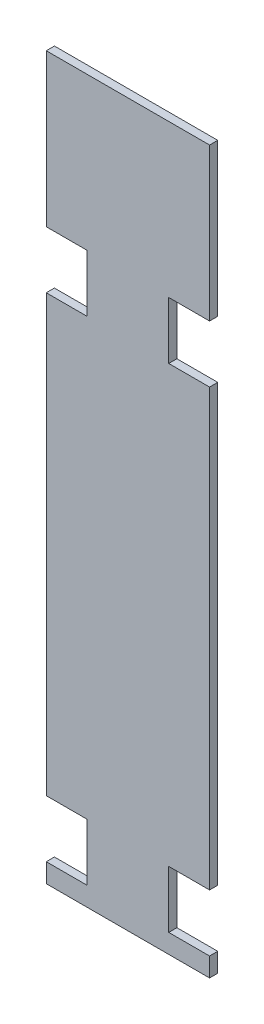
ISO-10303-21;
HEADER;
FILE_DESCRIPTION(('STEP AP214'),'2;1');
FILE_NAME('part.step','',(''),(''),'','','');
FILE_SCHEMA(('AUTOMOTIVE_DESIGN { 1 0 10303 214 1 1 1 1 }'));
ENDSEC;
DATA;
#1=APPLICATION_CONTEXT('core data for automotive mechanical design processes');
#2=APPLICATION_PROTOCOL_DEFINITION('international standard','automotive_design',2000,#1);
#3=PRODUCT_CONTEXT('',#1,'mechanical');
#4=PRODUCT('Part','Part','',(#3));
#5=PRODUCT_RELATED_PRODUCT_CATEGORY('part','',(#4));
#6=PRODUCT_DEFINITION_FORMATION('','',#4);
#7=PRODUCT_DEFINITION_CONTEXT('part definition',#1,'design');
#8=PRODUCT_DEFINITION('design','',#6,#7);
#9=PRODUCT_DEFINITION_SHAPE('','',#8);
#10=(LENGTH_UNIT() NAMED_UNIT(*) SI_UNIT(.MILLI.,.METRE.));
#11=(NAMED_UNIT(*) PLANE_ANGLE_UNIT() SI_UNIT($,.RADIAN.));
#12=(NAMED_UNIT(*) SI_UNIT($,.STERADIAN.) SOLID_ANGLE_UNIT());
#13=UNCERTAINTY_MEASURE_WITH_UNIT(LENGTH_MEASURE(1.E-05),#10,'distance_accuracy_value','');
#14=(GEOMETRIC_REPRESENTATION_CONTEXT(3) GLOBAL_UNCERTAINTY_ASSIGNED_CONTEXT((#13)) GLOBAL_UNIT_ASSIGNED_CONTEXT((#10,
#11,#12)) REPRESENTATION_CONTEXT('',''));
#15=CARTESIAN_POINT('',(0.,0.,0.));
#16=DIRECTION('',(0.,0.,1.));
#17=DIRECTION('',(1.,0.,0.));
#18=AXIS2_PLACEMENT_3D('',#15,#16,#17);
#19=CARTESIAN_POINT('',(60.,265.,3.));
#20=DIRECTION('',(-1.,0.,0.));
#21=DIRECTION('',(0.,0.,1.));
#22=AXIS2_PLACEMENT_3D('',#19,#20,#21);
#23=PLANE('',#22);
#24=DIRECTION('',(0.,1.,0.));
#25=VECTOR('',#24,1.);
#26=CARTESIAN_POINT('',(60.,0.,3.));
#27=LINE('',#26,#25);
#28=CARTESIAN_POINT('',(60.,209.,3.));
#29=VERTEX_POINT('',#28);
#30=CARTESIAN_POINT('',(60.,265.,3.));
#31=VERTEX_POINT('',#30);
#32=EDGE_CURVE('E215',#29,#31,#27,.T.);
#33=ORIENTED_EDGE('',*,*,#32,.F.);
#34=DIRECTION('',(0.,0.,-1.));
#35=VECTOR('',#34,1.);
#36=CARTESIAN_POINT('',(60.,209.,3.));
#37=LINE('',#36,#35);
#38=CARTESIAN_POINT('',(60.,209.,0.));
#39=VERTEX_POINT('',#38);
#40=EDGE_CURVE('E295',#29,#39,#37,.T.);
#41=ORIENTED_EDGE('',*,*,#40,.T.);
#42=DIRECTION('',(0.,1.,0.));
#43=VECTOR('',#42,1.);
#44=CARTESIAN_POINT('',(60.,265.,0.));
#45=LINE('',#44,#43);
#46=CARTESIAN_POINT('',(60.,265.,0.));
#47=VERTEX_POINT('',#46);
#48=EDGE_CURVE('E227',#39,#47,#45,.T.);
#49=ORIENTED_EDGE('',*,*,#48,.T.);
#50=DIRECTION('',(0.,0.,-1.));
#51=VECTOR('',#50,1.);
#52=CARTESIAN_POINT('',(60.,265.,3.));
#53=LINE('',#52,#51);
#54=EDGE_CURVE('E240',#31,#47,#53,.T.);
#55=ORIENTED_EDGE('',*,*,#54,.F.);
#56=EDGE_LOOP('',(#33,#41,#49,#55));
#57=FACE_BOUND('',#56,.T.);
#58=ADVANCED_FACE('F37',(#57),#23,.F.);
#59=CARTESIAN_POINT('',(60.,28.,0.));
#60=VERTEX_POINT('',#59);
#61=CARTESIAN_POINT('',(60.,188.,0.));
#62=VERTEX_POINT('',#61);
#63=EDGE_CURVE('E233',#60,#62,#45,.T.);
#64=ORIENTED_EDGE('',*,*,#63,.T.);
#65=DIRECTION('',(0.,0.,-1.));
#66=VECTOR('',#65,1.);
#67=CARTESIAN_POINT('',(60.,188.,3.));
#68=LINE('',#67,#66);
#69=CARTESIAN_POINT('',(60.,188.,3.));
#70=VERTEX_POINT('',#69);
#71=EDGE_CURVE('E52',#70,#62,#68,.T.);
#72=ORIENTED_EDGE('',*,*,#71,.F.);
#73=CARTESIAN_POINT('',(60.,28.,3.));
#74=VERTEX_POINT('',#73);
#75=EDGE_CURVE('E220',#74,#70,#27,.T.);
#76=ORIENTED_EDGE('',*,*,#75,.F.);
#77=DIRECTION('',(0.,0.,-1.));
#78=VECTOR('',#77,1.);
#79=CARTESIAN_POINT('',(60.,28.,3.));
#80=LINE('',#79,#78);
#81=EDGE_CURVE('E228',#74,#60,#80,.T.);
#82=ORIENTED_EDGE('',*,*,#81,.T.);
#83=EDGE_LOOP('',(#64,#72,#76,#82));
#84=FACE_BOUND('',#83,.T.);
#85=ADVANCED_FACE('F360',(#84),#23,.F.);
#86=CARTESIAN_POINT('',(0.,240.,3.));
#87=DIRECTION('',(1.,0.,0.));
#88=DIRECTION('',(0.,0.,-1.));
#89=AXIS2_PLACEMENT_3D('',#86,#87,#88);
#90=PLANE('',#89);
#91=DIRECTION('',(0.,-1.,0.));
#92=VECTOR('',#91,1.);
#93=CARTESIAN_POINT('',(0.,0.,3.));
#94=LINE('',#93,#92);
#95=CARTESIAN_POINT('',(0.,188.,3.));
#96=VERTEX_POINT('',#95);
#97=CARTESIAN_POINT('',(0.,28.,3.));
#98=VERTEX_POINT('',#97);
#99=EDGE_CURVE('E194',#96,#98,#94,.T.);
#100=ORIENTED_EDGE('',*,*,#99,.F.);
#101=DIRECTION('',(0.,0.,-1.));
#102=VECTOR('',#101,1.);
#103=CARTESIAN_POINT('',(0.,188.,3.));
#104=LINE('',#103,#102);
#105=CARTESIAN_POINT('',(0.,188.,0.));
#106=VERTEX_POINT('',#105);
#107=EDGE_CURVE('E319',#96,#106,#104,.T.);
#108=ORIENTED_EDGE('',*,*,#107,.T.);
#109=DIRECTION('',(0.,-1.,0.));
#110=VECTOR('',#109,1.);
#111=CARTESIAN_POINT('',(0.,240.,0.));
#112=LINE('',#111,#110);
#113=CARTESIAN_POINT('',(0.,28.,0.));
#114=VERTEX_POINT('',#113);
#115=EDGE_CURVE('E196',#106,#114,#112,.T.);
#116=ORIENTED_EDGE('',*,*,#115,.T.);
#117=DIRECTION('',(0.,0.,-1.));
#118=VECTOR('',#117,1.);
#119=CARTESIAN_POINT('',(0.,28.,3.));
#120=LINE('',#119,#118);
#121=EDGE_CURVE('E179',#98,#114,#120,.T.);
#122=ORIENTED_EDGE('',*,*,#121,.F.);
#123=EDGE_LOOP('',(#100,#108,#116,#122));
#124=FACE_BOUND('',#123,.T.);
#125=ADVANCED_FACE('F192',(#124),#90,.F.);
#126=CARTESIAN_POINT('',(0.,7.,3.));
#127=VERTEX_POINT('',#126);
#128=CARTESIAN_POINT('',(0.,0.,3.));
#129=VERTEX_POINT('',#128);
#130=EDGE_CURVE('E206',#127,#129,#94,.T.);
#131=ORIENTED_EDGE('',*,*,#130,.F.);
#132=DIRECTION('',(0.,0.,-1.));
#133=VECTOR('',#132,1.);
#134=CARTESIAN_POINT('',(0.,7.,3.));
#135=LINE('',#134,#133);
#136=CARTESIAN_POINT('',(0.,7.,0.));
#137=VERTEX_POINT('',#136);
#138=EDGE_CURVE('E261',#127,#137,#135,.T.);
#139=ORIENTED_EDGE('',*,*,#138,.T.);
#140=CARTESIAN_POINT('',(0.,0.,0.));
#141=VERTEX_POINT('',#140);
#142=EDGE_CURVE('E235',#137,#141,#112,.T.);
#143=ORIENTED_EDGE('',*,*,#142,.T.);
#144=DIRECTION('',(0.,0.,-1.));
#145=VECTOR('',#144,1.);
#146=CARTESIAN_POINT('',(0.,0.,3.));
#147=LINE('',#146,#145);
#148=EDGE_CURVE('E11',#129,#141,#147,.T.);
#149=ORIENTED_EDGE('',*,*,#148,.F.);
#150=EDGE_LOOP('',(#131,#139,#143,#149));
#151=FACE_BOUND('',#150,.T.);
#152=ADVANCED_FACE('F352',(#151),#90,.F.);
#153=CARTESIAN_POINT('',(0.,0.,3.));
#154=DIRECTION('',(0.,1.,0.));
#155=DIRECTION('',(0.,0.,1.));
#156=AXIS2_PLACEMENT_3D('',#153,#154,#155);
#157=PLANE('',#156);
#158=DIRECTION('',(1.,0.,0.));
#159=VECTOR('',#158,1.);
#160=CARTESIAN_POINT('',(0.,0.,0.));
#161=LINE('',#160,#159);
#162=CARTESIAN_POINT('',(60.,0.,0.));
#163=VERTEX_POINT('',#162);
#164=EDGE_CURVE('E224',#141,#163,#161,.T.);
#165=ORIENTED_EDGE('',*,*,#164,.T.);
#166=DIRECTION('',(0.,0.,-1.));
#167=VECTOR('',#166,1.);
#168=CARTESIAN_POINT('',(60.,0.,3.));
#169=LINE('',#168,#167);
#170=CARTESIAN_POINT('',(60.,0.,3.));
#171=VERTEX_POINT('',#170);
#172=EDGE_CURVE('E45',#171,#163,#169,.T.);
#173=ORIENTED_EDGE('',*,*,#172,.F.);
#174=DIRECTION('',(1.,0.,0.));
#175=VECTOR('',#174,1.);
#176=CARTESIAN_POINT('',(0.,0.,3.));
#177=LINE('',#176,#175);
#178=EDGE_CURVE('E209',#129,#171,#177,.T.);
#179=ORIENTED_EDGE('',*,*,#178,.F.);
#180=ORIENTED_EDGE('',*,*,#148,.T.);
#181=EDGE_LOOP('',(#165,#173,#179,#180));
#182=FACE_BOUND('',#181,.T.);
#183=ADVANCED_FACE('F39',(#182),#157,.F.);
#184=CARTESIAN_POINT('',(60.,7.00000000000001,0.));
#185=VERTEX_POINT('',#184);
#186=EDGE_CURVE('E229',#163,#185,#45,.T.);
#187=ORIENTED_EDGE('',*,*,#186,.T.);
#188=DIRECTION('',(0.,0.,-1.));
#189=VECTOR('',#188,1.);
#190=CARTESIAN_POINT('',(60.,7.,3.));
#191=LINE('',#190,#189);
#192=CARTESIAN_POINT('',(60.,7.,3.));
#193=VERTEX_POINT('',#192);
#194=EDGE_CURVE('E60',#193,#185,#191,.T.);
#195=ORIENTED_EDGE('',*,*,#194,.F.);
#196=EDGE_CURVE('E216',#171,#193,#27,.T.);
#197=ORIENTED_EDGE('',*,*,#196,.F.);
#198=ORIENTED_EDGE('',*,*,#172,.T.);
#199=EDGE_LOOP('',(#187,#195,#197,#198));
#200=FACE_BOUND('',#199,.T.);
#201=ADVANCED_FACE('F246',(#200),#23,.F.);
#202=CARTESIAN_POINT('',(0.,265.,3.));
#203=DIRECTION('',(0.,-1.,0.));
#204=DIRECTION('',(0.,0.,-1.));
#205=AXIS2_PLACEMENT_3D('',#202,#203,#204);
#206=PLANE('',#205);
#207=DIRECTION('',(-1.,0.,0.));
#208=VECTOR('',#207,1.);
#209=CARTESIAN_POINT('',(0.,265.,0.));
#210=LINE('',#209,#208);
#211=CARTESIAN_POINT('',(0.,265.,0.));
#212=VERTEX_POINT('',#211);
#213=EDGE_CURVE('E232',#47,#212,#210,.T.);
#214=ORIENTED_EDGE('',*,*,#213,.T.);
#215=DIRECTION('',(0.,0.,-1.));
#216=VECTOR('',#215,1.);
#217=CARTESIAN_POINT('',(0.,265.,3.));
#218=LINE('',#217,#216);
#219=CARTESIAN_POINT('',(0.,265.,3.));
#220=VERTEX_POINT('',#219);
#221=EDGE_CURVE('E223',#220,#212,#218,.T.);
#222=ORIENTED_EDGE('',*,*,#221,.F.);
#223=DIRECTION('',(-1.,0.,0.));
#224=VECTOR('',#223,1.);
#225=CARTESIAN_POINT('',(0.,265.,3.));
#226=LINE('',#225,#224);
#227=EDGE_CURVE('E219',#31,#220,#226,.T.);
#228=ORIENTED_EDGE('',*,*,#227,.F.);
#229=ORIENTED_EDGE('',*,*,#54,.T.);
#230=EDGE_LOOP('',(#214,#222,#228,#229));
#231=FACE_BOUND('',#230,.T.);
#232=ADVANCED_FACE('F369',(#231),#206,.F.);
#233=CARTESIAN_POINT('',(0.,209.,0.));
#234=VERTEX_POINT('',#233);
#235=EDGE_CURVE('E210',#212,#234,#112,.T.);
#236=ORIENTED_EDGE('',*,*,#235,.T.);
#237=DIRECTION('',(0.,0.,-1.));
#238=VECTOR('',#237,1.);
#239=CARTESIAN_POINT('',(0.,209.,3.));
#240=LINE('',#239,#238);
#241=CARTESIAN_POINT('',(0.,209.,3.));
#242=VERTEX_POINT('',#241);
#243=EDGE_CURVE('E313',#242,#234,#240,.T.);
#244=ORIENTED_EDGE('',*,*,#243,.F.);
#245=EDGE_CURVE('E205',#220,#242,#94,.T.);
#246=ORIENTED_EDGE('',*,*,#245,.F.);
#247=ORIENTED_EDGE('',*,*,#221,.T.);
#248=EDGE_LOOP('',(#236,#244,#246,#247));
#249=FACE_BOUND('',#248,.T.);
#250=ADVANCED_FACE('F376',(#249),#90,.F.);
#251=CARTESIAN_POINT('',(0.,0.,3.));
#252=DIRECTION('',(0.,0.,-1.));
#253=DIRECTION('',(-1.,0.,0.));
#254=AXIS2_PLACEMENT_3D('',#251,#252,#253);
#255=PLANE('',#254);
#256=DIRECTION('',(0.,1.,0.));
#257=VECTOR('',#256,1.);
#258=CARTESIAN_POINT('',(45.,209.,3.));
#259=LINE('',#258,#257);
#260=CARTESIAN_POINT('',(45.,188.,3.));
#261=VERTEX_POINT('',#260);
#262=CARTESIAN_POINT('',(45.,209.,3.));
#263=VERTEX_POINT('',#262);
#264=EDGE_CURVE('E309',#261,#263,#259,.T.);
#265=ORIENTED_EDGE('',*,*,#264,.T.);
#266=DIRECTION('',(1.,0.,0.));
#267=VECTOR('',#266,1.);
#268=CARTESIAN_POINT('',(60.,209.,3.));
#269=LINE('',#268,#267);
#270=EDGE_CURVE('E291',#263,#29,#269,.T.);
#271=ORIENTED_EDGE('',*,*,#270,.T.);
#272=ORIENTED_EDGE('',*,*,#32,.T.);
#273=ORIENTED_EDGE('',*,*,#227,.T.);
#274=ORIENTED_EDGE('',*,*,#245,.T.);
#275=DIRECTION('',(1.,0.,0.));
#276=VECTOR('',#275,1.);
#277=CARTESIAN_POINT('',(0.,209.,3.));
#278=LINE('',#277,#276);
#279=CARTESIAN_POINT('',(15.,209.,3.));
#280=VERTEX_POINT('',#279);
#281=EDGE_CURVE('E324',#242,#280,#278,.T.);
#282=ORIENTED_EDGE('',*,*,#281,.T.);
#283=DIRECTION('',(0.,-1.,0.));
#284=VECTOR('',#283,1.);
#285=CARTESIAN_POINT('',(15.,209.,3.));
#286=LINE('',#285,#284);
#287=CARTESIAN_POINT('',(15.,188.,3.));
#288=VERTEX_POINT('',#287);
#289=EDGE_CURVE('E331',#280,#288,#286,.T.);
#290=ORIENTED_EDGE('',*,*,#289,.T.);
#291=DIRECTION('',(-1.,0.,0.));
#292=VECTOR('',#291,1.);
#293=CARTESIAN_POINT('',(15.,188.,3.));
#294=LINE('',#293,#292);
#295=EDGE_CURVE('E204',#288,#96,#294,.T.);
#296=ORIENTED_EDGE('',*,*,#295,.T.);
#297=ORIENTED_EDGE('',*,*,#99,.T.);
#298=DIRECTION('',(1.,0.,0.));
#299=VECTOR('',#298,1.);
#300=CARTESIAN_POINT('',(0.,28.,3.));
#301=LINE('',#300,#299);
#302=CARTESIAN_POINT('',(15.,28.,3.));
#303=VERTEX_POINT('',#302);
#304=EDGE_CURVE('E175',#98,#303,#301,.T.);
#305=ORIENTED_EDGE('',*,*,#304,.T.);
#306=DIRECTION('',(0.,-1.,0.));
#307=VECTOR('',#306,1.);
#308=CARTESIAN_POINT('',(15.,28.,3.));
#309=LINE('',#308,#307);
#310=CARTESIAN_POINT('',(15.,7.,3.));
#311=VERTEX_POINT('',#310);
#312=EDGE_CURVE('E186',#303,#311,#309,.T.);
#313=ORIENTED_EDGE('',*,*,#312,.T.);
#314=DIRECTION('',(-1.,0.,0.));
#315=VECTOR('',#314,1.);
#316=CARTESIAN_POINT('',(0.,7.,3.));
#317=LINE('',#316,#315);
#318=EDGE_CURVE('E197',#311,#127,#317,.T.);
#319=ORIENTED_EDGE('',*,*,#318,.T.);
#320=ORIENTED_EDGE('',*,*,#130,.T.);
#321=ORIENTED_EDGE('',*,*,#178,.T.);
#322=ORIENTED_EDGE('',*,*,#196,.T.);
#323=DIRECTION('',(-1.,0.,0.));
#324=VECTOR('',#323,1.);
#325=CARTESIAN_POINT('',(60.,7.,3.));
#326=LINE('',#325,#324);
#327=CARTESIAN_POINT('',(45.,7.,3.));
#328=VERTEX_POINT('',#327);
#329=EDGE_CURVE('E273',#193,#328,#326,.T.);
#330=ORIENTED_EDGE('',*,*,#329,.T.);
#331=DIRECTION('',(0.,1.,0.));
#332=VECTOR('',#331,1.);
#333=CARTESIAN_POINT('',(45.,7.,3.));
#334=LINE('',#333,#332);
#335=CARTESIAN_POINT('',(45.,28.,3.));
#336=VERTEX_POINT('',#335);
#337=EDGE_CURVE('E281',#328,#336,#334,.T.);
#338=ORIENTED_EDGE('',*,*,#337,.T.);
#339=DIRECTION('',(1.,0.,0.));
#340=VECTOR('',#339,1.);
#341=CARTESIAN_POINT('',(45.,28.,3.));
#342=LINE('',#341,#340);
#343=EDGE_CURVE('E269',#336,#74,#342,.T.);
#344=ORIENTED_EDGE('',*,*,#343,.T.);
#345=ORIENTED_EDGE('',*,*,#75,.T.);
#346=DIRECTION('',(-1.,0.,0.));
#347=VECTOR('',#346,1.);
#348=CARTESIAN_POINT('',(45.,188.,3.));
#349=LINE('',#348,#347);
#350=EDGE_CURVE('E301',#70,#261,#349,.T.);
#351=ORIENTED_EDGE('',*,*,#350,.T.);
#352=EDGE_LOOP('',(#265,#271,#272,#273,#274,#282,#290,#296,#297,#305,#313,#319,#320,#321,#322,
#330,#338,#344,#345,#351));
#353=FACE_BOUND('',#352,.T.);
#354=ADVANCED_FACE('F201',(#353),#255,.F.);
#355=CARTESIAN_POINT('',(0.,0.,0.));
#356=DIRECTION('',(0.,0.,-1.));
#357=DIRECTION('',(-1.,0.,0.));
#358=AXIS2_PLACEMENT_3D('',#355,#356,#357);
#359=PLANE('',#358);
#360=DIRECTION('',(1.,0.,0.));
#361=VECTOR('',#360,1.);
#362=CARTESIAN_POINT('',(60.,209.,0.));
#363=LINE('',#362,#361);
#364=CARTESIAN_POINT('',(45.,209.,0.));
#365=VERTEX_POINT('',#364);
#366=EDGE_CURVE('E299',#365,#39,#363,.T.);
#367=ORIENTED_EDGE('',*,*,#366,.F.);
#368=DIRECTION('',(0.,1.,0.));
#369=VECTOR('',#368,1.);
#370=CARTESIAN_POINT('',(45.,209.,0.));
#371=LINE('',#370,#369);
#372=CARTESIAN_POINT('',(45.,188.,0.));
#373=VERTEX_POINT('',#372);
#374=EDGE_CURVE('E302',#373,#365,#371,.T.);
#375=ORIENTED_EDGE('',*,*,#374,.F.);
#376=DIRECTION('',(-1.,0.,0.));
#377=VECTOR('',#376,1.);
#378=CARTESIAN_POINT('',(45.,188.,0.));
#379=LINE('',#378,#377);
#380=EDGE_CURVE('E305',#62,#373,#379,.T.);
#381=ORIENTED_EDGE('',*,*,#380,.F.);
#382=ORIENTED_EDGE('',*,*,#63,.F.);
#383=DIRECTION('',(1.,0.,0.));
#384=VECTOR('',#383,1.);
#385=CARTESIAN_POINT('',(45.,28.,0.));
#386=LINE('',#385,#384);
#387=CARTESIAN_POINT('',(45.,28.,0.));
#388=VERTEX_POINT('',#387);
#389=EDGE_CURVE('E263',#388,#60,#386,.T.);
#390=ORIENTED_EDGE('',*,*,#389,.F.);
#391=DIRECTION('',(0.,1.,0.));
#392=VECTOR('',#391,1.);
#393=CARTESIAN_POINT('',(45.,7.,0.));
#394=LINE('',#393,#392);
#395=CARTESIAN_POINT('',(45.,7.,0.));
#396=VERTEX_POINT('',#395);
#397=EDGE_CURVE('E260',#396,#388,#394,.T.);
#398=ORIENTED_EDGE('',*,*,#397,.F.);
#399=DIRECTION('',(-1.,0.,0.));
#400=VECTOR('',#399,1.);
#401=CARTESIAN_POINT('',(60.,7.,0.));
#402=LINE('',#401,#400);
#403=EDGE_CURVE('E257',#185,#396,#402,.T.);
#404=ORIENTED_EDGE('',*,*,#403,.F.);
#405=ORIENTED_EDGE('',*,*,#186,.F.);
#406=ORIENTED_EDGE('',*,*,#164,.F.);
#407=ORIENTED_EDGE('',*,*,#142,.F.);
#408=DIRECTION('',(-1.,0.,0.));
#409=VECTOR('',#408,1.);
#410=CARTESIAN_POINT('',(0.,7.,0.));
#411=LINE('',#410,#409);
#412=CARTESIAN_POINT('',(15.,7.,0.));
#413=VERTEX_POINT('',#412);
#414=EDGE_CURVE('E187',#413,#137,#411,.T.);
#415=ORIENTED_EDGE('',*,*,#414,.F.);
#416=DIRECTION('',(0.,-1.,0.));
#417=VECTOR('',#416,1.);
#418=CARTESIAN_POINT('',(15.,28.,0.));
#419=LINE('',#418,#417);
#420=CARTESIAN_POINT('',(15.,28.,0.));
#421=VERTEX_POINT('',#420);
#422=EDGE_CURVE('E338',#421,#413,#419,.T.);
#423=ORIENTED_EDGE('',*,*,#422,.F.);
#424=DIRECTION('',(1.,0.,0.));
#425=VECTOR('',#424,1.);
#426=CARTESIAN_POINT('',(0.,28.,0.));
#427=LINE('',#426,#425);
#428=EDGE_CURVE('E321',#114,#421,#427,.T.);
#429=ORIENTED_EDGE('',*,*,#428,.F.);
#430=ORIENTED_EDGE('',*,*,#115,.F.);
#431=DIRECTION('',(-1.,0.,0.));
#432=VECTOR('',#431,1.);
#433=CARTESIAN_POINT('',(15.,188.,0.));
#434=LINE('',#433,#432);
#435=CARTESIAN_POINT('',(15.,188.,0.));
#436=VERTEX_POINT('',#435);
#437=EDGE_CURVE('E322',#436,#106,#434,.T.);
#438=ORIENTED_EDGE('',*,*,#437,.F.);
#439=DIRECTION('',(0.,-1.,0.));
#440=VECTOR('',#439,1.);
#441=CARTESIAN_POINT('',(15.,209.,0.));
#442=LINE('',#441,#440);
#443=CARTESIAN_POINT('',(15.,209.,0.));
#444=VERTEX_POINT('',#443);
#445=EDGE_CURVE('E325',#444,#436,#442,.T.);
#446=ORIENTED_EDGE('',*,*,#445,.F.);
#447=DIRECTION('',(1.,0.,0.));
#448=VECTOR('',#447,1.);
#449=CARTESIAN_POINT('',(0.,209.,0.));
#450=LINE('',#449,#448);
#451=EDGE_CURVE('E298',#234,#444,#450,.T.);
#452=ORIENTED_EDGE('',*,*,#451,.F.);
#453=ORIENTED_EDGE('',*,*,#235,.F.);
#454=ORIENTED_EDGE('',*,*,#213,.F.);
#455=ORIENTED_EDGE('',*,*,#48,.F.);
#456=EDGE_LOOP('',(#367,#375,#381,#382,#390,#398,#404,#405,#406,#407,#415,#423,#429,#430,#438,
#446,#452,#453,#454,#455));
#457=FACE_BOUND('',#456,.T.);
#458=ADVANCED_FACE('F254',(#457),#359,.T.);
#459=CARTESIAN_POINT('',(45.,28.,3.));
#460=DIRECTION('',(0.,1.,0.));
#461=DIRECTION('',(-1.,0.,0.));
#462=AXIS2_PLACEMENT_3D('',#459,#460,#461);
#463=PLANE('',#462);
#464=ORIENTED_EDGE('',*,*,#389,.T.);
#465=ORIENTED_EDGE('',*,*,#81,.F.);
#466=ORIENTED_EDGE('',*,*,#343,.F.);
#467=DIRECTION('',(0.,0.,-1.));
#468=VECTOR('',#467,1.);
#469=CARTESIAN_POINT('',(45.,28.,3.));
#470=LINE('',#469,#468);
#471=EDGE_CURVE('E276',#336,#388,#470,.T.);
#472=ORIENTED_EDGE('',*,*,#471,.T.);
#473=EDGE_LOOP('',(#464,#465,#466,#472));
#474=FACE_BOUND('',#473,.T.);
#475=ADVANCED_FACE('F356',(#474),#463,.F.);
#476=CARTESIAN_POINT('',(45.,7.,3.));
#477=DIRECTION('',(-1.,0.,0.));
#478=DIRECTION('',(0.,0.,1.));
#479=AXIS2_PLACEMENT_3D('',#476,#477,#478);
#480=PLANE('',#479);
#481=ORIENTED_EDGE('',*,*,#397,.T.);
#482=ORIENTED_EDGE('',*,*,#471,.F.);
#483=ORIENTED_EDGE('',*,*,#337,.F.);
#484=DIRECTION('',(0.,0.,-1.));
#485=VECTOR('',#484,1.);
#486=CARTESIAN_POINT('',(45.,7.,3.));
#487=LINE('',#486,#485);
#488=EDGE_CURVE('E277',#328,#396,#487,.T.);
#489=ORIENTED_EDGE('',*,*,#488,.T.);
#490=EDGE_LOOP('',(#481,#482,#483,#489));
#491=FACE_BOUND('',#490,.T.);
#492=ADVANCED_FACE('F354',(#491),#480,.F.);
#493=CARTESIAN_POINT('',(60.,7.,3.));
#494=DIRECTION('',(0.,-1.,0.));
#495=DIRECTION('',(0.,0.,-1.));
#496=AXIS2_PLACEMENT_3D('',#493,#494,#495);
#497=PLANE('',#496);
#498=ORIENTED_EDGE('',*,*,#403,.T.);
#499=ORIENTED_EDGE('',*,*,#488,.F.);
#500=ORIENTED_EDGE('',*,*,#329,.F.);
#501=ORIENTED_EDGE('',*,*,#194,.T.);
#502=EDGE_LOOP('',(#498,#499,#500,#501));
#503=FACE_BOUND('',#502,.T.);
#504=ADVANCED_FACE('F353',(#503),#497,.F.);
#505=CARTESIAN_POINT('',(0.,7.,3.));
#506=DIRECTION('',(0.,-1.,0.));
#507=DIRECTION('',(1.,0.,0.));
#508=AXIS2_PLACEMENT_3D('',#505,#506,#507);
#509=PLANE('',#508);
#510=ORIENTED_EDGE('',*,*,#414,.T.);
#511=ORIENTED_EDGE('',*,*,#138,.F.);
#512=ORIENTED_EDGE('',*,*,#318,.F.);
#513=DIRECTION('',(0.,0.,-1.));
#514=VECTOR('',#513,1.);
#515=CARTESIAN_POINT('',(15.,7.,3.));
#516=LINE('',#515,#514);
#517=EDGE_CURVE('E266',#311,#413,#516,.T.);
#518=ORIENTED_EDGE('',*,*,#517,.T.);
#519=EDGE_LOOP('',(#510,#511,#512,#518));
#520=FACE_BOUND('',#519,.T.);
#521=ADVANCED_FACE('F350',(#520),#509,.F.);
#522=CARTESIAN_POINT('',(15.,28.,3.));
#523=DIRECTION('',(1.,0.,0.));
#524=DIRECTION('',(0.,1.,0.));
#525=AXIS2_PLACEMENT_3D('',#522,#523,#524);
#526=PLANE('',#525);
#527=ORIENTED_EDGE('',*,*,#422,.T.);
#528=ORIENTED_EDGE('',*,*,#517,.F.);
#529=ORIENTED_EDGE('',*,*,#312,.F.);
#530=DIRECTION('',(0.,0.,-1.));
#531=VECTOR('',#530,1.);
#532=CARTESIAN_POINT('',(15.,28.,3.));
#533=LINE('',#532,#531);
#534=EDGE_CURVE('E181',#303,#421,#533,.T.);
#535=ORIENTED_EDGE('',*,*,#534,.T.);
#536=EDGE_LOOP('',(#527,#528,#529,#535));
#537=FACE_BOUND('',#536,.T.);
#538=ADVANCED_FACE('F347',(#537),#526,.F.);
#539=CARTESIAN_POINT('',(0.,28.,3.));
#540=DIRECTION('',(0.,1.,0.));
#541=DIRECTION('',(-1.,0.,0.));
#542=AXIS2_PLACEMENT_3D('',#539,#540,#541);
#543=PLANE('',#542);
#544=ORIENTED_EDGE('',*,*,#428,.T.);
#545=ORIENTED_EDGE('',*,*,#534,.F.);
#546=ORIENTED_EDGE('',*,*,#304,.F.);
#547=ORIENTED_EDGE('',*,*,#121,.T.);
#548=EDGE_LOOP('',(#544,#545,#546,#547));
#549=FACE_BOUND('',#548,.T.);
#550=ADVANCED_FACE('F178',(#549),#543,.F.);
#551=CARTESIAN_POINT('',(15.,188.,3.));
#552=DIRECTION('',(0.,-1.,0.));
#553=DIRECTION('',(0.,0.,-1.));
#554=AXIS2_PLACEMENT_3D('',#551,#552,#553);
#555=PLANE('',#554);
#556=ORIENTED_EDGE('',*,*,#437,.T.);
#557=ORIENTED_EDGE('',*,*,#107,.F.);
#558=ORIENTED_EDGE('',*,*,#295,.F.);
#559=DIRECTION('',(0.,0.,-1.));
#560=VECTOR('',#559,1.);
#561=CARTESIAN_POINT('',(15.,188.,3.));
#562=LINE('',#561,#560);
#563=EDGE_CURVE('E317',#288,#436,#562,.T.);
#564=ORIENTED_EDGE('',*,*,#563,.T.);
#565=EDGE_LOOP('',(#556,#557,#558,#564));
#566=FACE_BOUND('',#565,.T.);
#567=ADVANCED_FACE('F454',(#566),#555,.F.);
#568=CARTESIAN_POINT('',(15.,209.,3.));
#569=DIRECTION('',(1.,0.,0.));
#570=DIRECTION('',(0.,1.,0.));
#571=AXIS2_PLACEMENT_3D('',#568,#569,#570);
#572=PLANE('',#571);
#573=ORIENTED_EDGE('',*,*,#445,.T.);
#574=ORIENTED_EDGE('',*,*,#563,.F.);
#575=ORIENTED_EDGE('',*,*,#289,.F.);
#576=DIRECTION('',(0.,0.,-1.));
#577=VECTOR('',#576,1.);
#578=CARTESIAN_POINT('',(15.,209.,3.));
#579=LINE('',#578,#577);
#580=EDGE_CURVE('E315',#280,#444,#579,.T.);
#581=ORIENTED_EDGE('',*,*,#580,.T.);
#582=EDGE_LOOP('',(#573,#574,#575,#581));
#583=FACE_BOUND('',#582,.T.);
#584=ADVANCED_FACE('F392',(#583),#572,.F.);
#585=CARTESIAN_POINT('',(0.,209.,3.));
#586=DIRECTION('',(0.,1.,0.));
#587=DIRECTION('',(0.,0.,1.));
#588=AXIS2_PLACEMENT_3D('',#585,#586,#587);
#589=PLANE('',#588);
#590=ORIENTED_EDGE('',*,*,#451,.T.);
#591=ORIENTED_EDGE('',*,*,#580,.F.);
#592=ORIENTED_EDGE('',*,*,#281,.F.);
#593=ORIENTED_EDGE('',*,*,#243,.T.);
#594=EDGE_LOOP('',(#590,#591,#592,#593));
#595=FACE_BOUND('',#594,.T.);
#596=ADVANCED_FACE('F385',(#595),#589,.F.);
#597=CARTESIAN_POINT('',(60.,209.,3.));
#598=DIRECTION('',(0.,1.,0.));
#599=DIRECTION('',(0.,0.,1.));
#600=AXIS2_PLACEMENT_3D('',#597,#598,#599);
#601=PLANE('',#600);
#602=ORIENTED_EDGE('',*,*,#366,.T.);
#603=ORIENTED_EDGE('',*,*,#40,.F.);
#604=ORIENTED_EDGE('',*,*,#270,.F.);
#605=DIRECTION('',(0.,0.,-1.));
#606=VECTOR('',#605,1.);
#607=CARTESIAN_POINT('',(45.,209.,3.));
#608=LINE('',#607,#606);
#609=EDGE_CURVE('E293',#263,#365,#608,.T.);
#610=ORIENTED_EDGE('',*,*,#609,.T.);
#611=EDGE_LOOP('',(#602,#603,#604,#610));
#612=FACE_BOUND('',#611,.T.);
#613=ADVANCED_FACE('F383',(#612),#601,.F.);
#614=CARTESIAN_POINT('',(45.,209.,3.));
#615=DIRECTION('',(-1.,0.,0.));
#616=DIRECTION('',(0.,0.,1.));
#617=AXIS2_PLACEMENT_3D('',#614,#615,#616);
#618=PLANE('',#617);
#619=ORIENTED_EDGE('',*,*,#374,.T.);
#620=ORIENTED_EDGE('',*,*,#609,.F.);
#621=ORIENTED_EDGE('',*,*,#264,.F.);
#622=DIRECTION('',(0.,0.,-1.));
#623=VECTOR('',#622,1.);
#624=CARTESIAN_POINT('',(45.,188.,3.));
#625=LINE('',#624,#623);
#626=EDGE_CURVE('E290',#261,#373,#625,.T.);
#627=ORIENTED_EDGE('',*,*,#626,.T.);
#628=EDGE_LOOP('',(#619,#620,#621,#627));
#629=FACE_BOUND('',#628,.T.);
#630=ADVANCED_FACE('F381',(#629),#618,.F.);
#631=CARTESIAN_POINT('',(45.,188.,3.));
#632=DIRECTION('',(0.,-1.,0.));
#633=DIRECTION('',(0.,0.,-1.));
#634=AXIS2_PLACEMENT_3D('',#631,#632,#633);
#635=PLANE('',#634);
#636=ORIENTED_EDGE('',*,*,#380,.T.);
#637=ORIENTED_EDGE('',*,*,#626,.F.);
#638=ORIENTED_EDGE('',*,*,#350,.F.);
#639=ORIENTED_EDGE('',*,*,#71,.T.);
#640=EDGE_LOOP('',(#636,#637,#638,#639));
#641=FACE_BOUND('',#640,.T.);
#642=ADVANCED_FACE('F379',(#641),#635,.F.);
#643=CLOSED_SHELL('',(#58,#85,#125,#152,#183,#201,#232,#250,#354,#458,#475,#492,#504,#521,#538,
#550,#567,#584,#596,#613,#630,#642));
#644=MANIFOLD_SOLID_BREP('B2',#643);
#645=ADVANCED_BREP_SHAPE_REPRESENTATION('',(#18,#644),#14);
#646=SHAPE_DEFINITION_REPRESENTATION(#9,#645);
ENDSEC;
END-ISO-10303-21;
